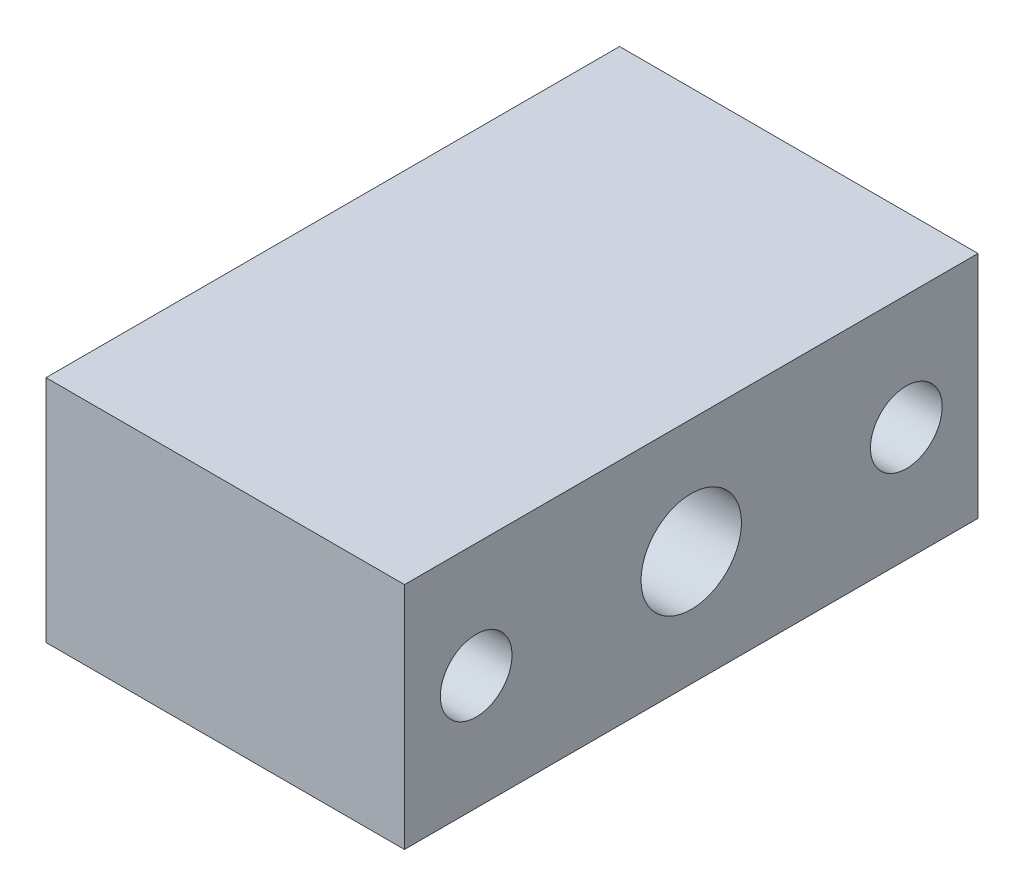
ISO-10303-21;
HEADER;
FILE_DESCRIPTION(('STEP AP214'),'2;1');
FILE_NAME('part.step','',(''),(''),'','','');
FILE_SCHEMA(('AUTOMOTIVE_DESIGN { 1 0 10303 214 1 1 1 1 }'));
ENDSEC;
DATA;
#1=APPLICATION_CONTEXT('core data for automotive mechanical design processes');
#2=APPLICATION_PROTOCOL_DEFINITION('international standard','automotive_design',2000,#1);
#3=PRODUCT_CONTEXT('',#1,'mechanical');
#4=PRODUCT('Part','Part','',(#3));
#5=PRODUCT_RELATED_PRODUCT_CATEGORY('part','',(#4));
#6=PRODUCT_DEFINITION_FORMATION('','',#4);
#7=PRODUCT_DEFINITION_CONTEXT('part definition',#1,'design');
#8=PRODUCT_DEFINITION('design','',#6,#7);
#9=PRODUCT_DEFINITION_SHAPE('','',#8);
#10=(LENGTH_UNIT() NAMED_UNIT(*) SI_UNIT(.MILLI.,.METRE.));
#11=(NAMED_UNIT(*) PLANE_ANGLE_UNIT() SI_UNIT($,.RADIAN.));
#12=(NAMED_UNIT(*) SI_UNIT($,.STERADIAN.) SOLID_ANGLE_UNIT());
#13=UNCERTAINTY_MEASURE_WITH_UNIT(LENGTH_MEASURE(1.E-05),#10,'distance_accuracy_value','');
#14=(GEOMETRIC_REPRESENTATION_CONTEXT(3) GLOBAL_UNCERTAINTY_ASSIGNED_CONTEXT((#13)) GLOBAL_UNIT_ASSIGNED_CONTEXT((#10,
#11,#12)) REPRESENTATION_CONTEXT('',''));
#15=CARTESIAN_POINT('',(0.,0.,0.));
#16=DIRECTION('',(0.,0.,1.));
#17=DIRECTION('',(1.,0.,0.));
#18=AXIS2_PLACEMENT_3D('',#15,#16,#17);
#19=CARTESIAN_POINT('',(50.,-16.,-40.));
#20=DIRECTION('',(0.,0.,1.));
#21=DIRECTION('',(0.,-1.,0.));
#22=AXIS2_PLACEMENT_3D('',#19,#20,#21);
#23=PLANE('',#22);
#24=DIRECTION('',(0.,1.,0.));
#25=VECTOR('',#24,1.);
#26=CARTESIAN_POINT('',(0.,-16.,-40.));
#27=LINE('',#26,#25);
#28=CARTESIAN_POINT('',(0.,-16.,-40.));
#29=VERTEX_POINT('',#28);
#30=CARTESIAN_POINT('',(0.,16.,-40.));
#31=VERTEX_POINT('',#30);
#32=EDGE_CURVE('E106',#29,#31,#27,.T.);
#33=ORIENTED_EDGE('',*,*,#32,.T.);
#34=DIRECTION('',(-1.,0.,0.));
#35=VECTOR('',#34,1.);
#36=CARTESIAN_POINT('',(50.,16.,-40.));
#37=LINE('',#36,#35);
#38=CARTESIAN_POINT('',(50.,16.,-40.));
#39=VERTEX_POINT('',#38);
#40=EDGE_CURVE('E11',#39,#31,#37,.T.);
#41=ORIENTED_EDGE('',*,*,#40,.F.);
#42=DIRECTION('',(0.,1.,0.));
#43=VECTOR('',#42,1.);
#44=CARTESIAN_POINT('',(50.,-16.,-40.));
#45=LINE('',#44,#43);
#46=CARTESIAN_POINT('',(50.,-16.,-40.));
#47=VERTEX_POINT('',#46);
#48=EDGE_CURVE('E94',#47,#39,#45,.T.);
#49=ORIENTED_EDGE('',*,*,#48,.F.);
#50=DIRECTION('',(-1.,0.,0.));
#51=VECTOR('',#50,1.);
#52=CARTESIAN_POINT('',(50.,-16.,-40.));
#53=LINE('',#52,#51);
#54=EDGE_CURVE('E102',#47,#29,#53,.T.);
#55=ORIENTED_EDGE('',*,*,#54,.T.);
#56=EDGE_LOOP('',(#33,#41,#49,#55));
#57=FACE_BOUND('',#56,.T.);
#58=ADVANCED_FACE('F43',(#57),#23,.F.);
#59=CARTESIAN_POINT('',(50.,16.,40.));
#60=DIRECTION('',(0.,-1.,0.));
#61=DIRECTION('',(0.,0.,-1.));
#62=AXIS2_PLACEMENT_3D('',#59,#60,#61);
#63=PLANE('',#62);
#64=DIRECTION('',(0.,0.,1.));
#65=VECTOR('',#64,1.);
#66=CARTESIAN_POINT('',(0.,16.,40.));
#67=LINE('',#66,#65);
#68=CARTESIAN_POINT('',(0.,16.,40.));
#69=VERTEX_POINT('',#68);
#70=EDGE_CURVE('E98',#31,#69,#67,.T.);
#71=ORIENTED_EDGE('',*,*,#70,.T.);
#72=DIRECTION('',(-1.,0.,0.));
#73=VECTOR('',#72,1.);
#74=CARTESIAN_POINT('',(50.,16.,40.));
#75=LINE('',#74,#73);
#76=CARTESIAN_POINT('',(50.,16.,40.));
#77=VERTEX_POINT('',#76);
#78=EDGE_CURVE('E51',#77,#69,#75,.T.);
#79=ORIENTED_EDGE('',*,*,#78,.F.);
#80=DIRECTION('',(0.,0.,1.));
#81=VECTOR('',#80,1.);
#82=CARTESIAN_POINT('',(50.,16.,40.));
#83=LINE('',#82,#81);
#84=EDGE_CURVE('E89',#39,#77,#83,.T.);
#85=ORIENTED_EDGE('',*,*,#84,.F.);
#86=ORIENTED_EDGE('',*,*,#40,.T.);
#87=EDGE_LOOP('',(#71,#79,#85,#86));
#88=FACE_BOUND('',#87,.T.);
#89=ADVANCED_FACE('F97',(#88),#63,.F.);
#90=CARTESIAN_POINT('',(50.,-16.,40.));
#91=DIRECTION('',(0.,0.,-1.));
#92=DIRECTION('',(-1.,0.,0.));
#93=AXIS2_PLACEMENT_3D('',#90,#91,#92);
#94=PLANE('',#93);
#95=DIRECTION('',(0.,-1.,0.));
#96=VECTOR('',#95,1.);
#97=CARTESIAN_POINT('',(0.,-16.,40.));
#98=LINE('',#97,#96);
#99=CARTESIAN_POINT('',(0.,-16.,40.));
#100=VERTEX_POINT('',#99);
#101=EDGE_CURVE('E76',#69,#100,#98,.T.);
#102=ORIENTED_EDGE('',*,*,#101,.T.);
#103=DIRECTION('',(-1.,0.,0.));
#104=VECTOR('',#103,1.);
#105=CARTESIAN_POINT('',(50.,-16.,40.));
#106=LINE('',#105,#104);
#107=CARTESIAN_POINT('',(50.,-16.,40.));
#108=VERTEX_POINT('',#107);
#109=EDGE_CURVE('E99',#108,#100,#106,.T.);
#110=ORIENTED_EDGE('',*,*,#109,.F.);
#111=DIRECTION('',(0.,-1.,0.));
#112=VECTOR('',#111,1.);
#113=CARTESIAN_POINT('',(50.,-16.,40.));
#114=LINE('',#113,#112);
#115=EDGE_CURVE('E92',#77,#108,#114,.T.);
#116=ORIENTED_EDGE('',*,*,#115,.F.);
#117=ORIENTED_EDGE('',*,*,#78,.T.);
#118=EDGE_LOOP('',(#102,#110,#116,#117));
#119=FACE_BOUND('',#118,.T.);
#120=ADVANCED_FACE('F100',(#119),#94,.F.);
#121=CARTESIAN_POINT('',(50.,-16.,40.));
#122=DIRECTION('',(0.,1.,0.));
#123=DIRECTION('',(0.,0.,1.));
#124=AXIS2_PLACEMENT_3D('',#121,#122,#123);
#125=PLANE('',#124);
#126=DIRECTION('',(0.,0.,-1.));
#127=VECTOR('',#126,1.);
#128=CARTESIAN_POINT('',(0.,-16.,40.));
#129=LINE('',#128,#127);
#130=EDGE_CURVE('E82',#100,#29,#129,.T.);
#131=ORIENTED_EDGE('',*,*,#130,.T.);
#132=ORIENTED_EDGE('',*,*,#54,.F.);
#133=DIRECTION('',(0.,0.,-1.));
#134=VECTOR('',#133,1.);
#135=CARTESIAN_POINT('',(50.,-16.,40.));
#136=LINE('',#135,#134);
#137=EDGE_CURVE('E59',#108,#47,#136,.T.);
#138=ORIENTED_EDGE('',*,*,#137,.F.);
#139=ORIENTED_EDGE('',*,*,#109,.T.);
#140=EDGE_LOOP('',(#131,#132,#138,#139));
#141=FACE_BOUND('',#140,.T.);
#142=ADVANCED_FACE('F114',(#141),#125,.F.);
#143=CARTESIAN_POINT('',(50.,0.,0.));
#144=DIRECTION('',(-1.,0.,0.));
#145=DIRECTION('',(0.,0.,1.));
#146=AXIS2_PLACEMENT_3D('',#143,#144,#145);
#147=PLANE('',#146);
#148=CARTESIAN_POINT('',(50.,0.,-30.));
#149=DIRECTION('',(1.,0.,0.));
#150=DIRECTION('',(0.,0.,-1.));
#151=AXIS2_PLACEMENT_3D('',#148,#149,#150);
#152=CIRCLE('',#151,5.);
#153=CARTESIAN_POINT('',(50.,0.,-35.));
#154=VERTEX_POINT('',#153);
#155=EDGE_CURVE('E129',#154,#154,#152,.T.);
#156=ORIENTED_EDGE('',*,*,#155,.F.);
#157=EDGE_LOOP('',(#156));
#158=FACE_BOUND('',#157,.T.);
#159=CARTESIAN_POINT('',(50.,0.,30.));
#160=DIRECTION('',(-1.,0.,0.));
#161=DIRECTION('',(0.,0.,1.));
#162=AXIS2_PLACEMENT_3D('',#159,#160,#161);
#163=CIRCLE('',#162,5.);
#164=CARTESIAN_POINT('',(50.,0.,35.));
#165=VERTEX_POINT('',#164);
#166=EDGE_CURVE('E125',#165,#165,#163,.T.);
#167=ORIENTED_EDGE('',*,*,#166,.T.);
#168=EDGE_LOOP('',(#167));
#169=FACE_BOUND('',#168,.T.);
#170=CARTESIAN_POINT('',(50.,0.,0.));
#171=DIRECTION('',(-1.,0.,0.));
#172=DIRECTION('',(0.,0.,1.));
#173=AXIS2_PLACEMENT_3D('',#170,#171,#172);
#174=CIRCLE('',#173,6.99999999999999);
#175=CARTESIAN_POINT('',(50.,0.,6.99999999999999));
#176=VERTEX_POINT('',#175);
#177=EDGE_CURVE('E109',#176,#176,#174,.T.);
#178=ORIENTED_EDGE('',*,*,#177,.T.);
#179=EDGE_LOOP('',(#178));
#180=FACE_BOUND('',#179,.T.);
#181=ORIENTED_EDGE('',*,*,#48,.T.);
#182=ORIENTED_EDGE('',*,*,#84,.T.);
#183=ORIENTED_EDGE('',*,*,#115,.T.);
#184=ORIENTED_EDGE('',*,*,#137,.T.);
#185=EDGE_LOOP('',(#181,#182,#183,#184));
#186=FACE_BOUND('',#185,.T.);
#187=ADVANCED_FACE('F90',(#158,#169,#180,#186),#147,.F.);
#188=CARTESIAN_POINT('',(0.,0.,0.));
#189=DIRECTION('',(-1.,0.,0.));
#190=DIRECTION('',(0.,0.,1.));
#191=AXIS2_PLACEMENT_3D('',#188,#189,#190);
#192=PLANE('',#191);
#193=CARTESIAN_POINT('',(0.,0.,-30.));
#194=DIRECTION('',(1.,0.,0.));
#195=DIRECTION('',(0.,0.,-1.));
#196=AXIS2_PLACEMENT_3D('',#193,#194,#195);
#197=CIRCLE('',#196,5.);
#198=CARTESIAN_POINT('',(0.,0.,-35.));
#199=VERTEX_POINT('',#198);
#200=EDGE_CURVE('E132',#199,#199,#197,.T.);
#201=ORIENTED_EDGE('',*,*,#200,.T.);
#202=EDGE_LOOP('',(#201));
#203=FACE_BOUND('',#202,.T.);
#204=CARTESIAN_POINT('',(0.,0.,30.));
#205=DIRECTION('',(-1.,0.,0.));
#206=DIRECTION('',(0.,0.,1.));
#207=AXIS2_PLACEMENT_3D('',#204,#205,#206);
#208=CIRCLE('',#207,5.);
#209=CARTESIAN_POINT('',(0.,0.,35.));
#210=VERTEX_POINT('',#209);
#211=EDGE_CURVE('E126',#210,#210,#208,.T.);
#212=ORIENTED_EDGE('',*,*,#211,.F.);
#213=EDGE_LOOP('',(#212));
#214=FACE_BOUND('',#213,.T.);
#215=CARTESIAN_POINT('',(0.,0.,0.));
#216=DIRECTION('',(-1.,0.,0.));
#217=DIRECTION('',(0.,0.,1.));
#218=AXIS2_PLACEMENT_3D('',#215,#216,#217);
#219=CIRCLE('',#218,6.99999999999999);
#220=CARTESIAN_POINT('',(0.,0.,6.99999999999999));
#221=VERTEX_POINT('',#220);
#222=EDGE_CURVE('E122',#221,#221,#219,.T.);
#223=ORIENTED_EDGE('',*,*,#222,.F.);
#224=EDGE_LOOP('',(#223));
#225=FACE_BOUND('',#224,.T.);
#226=ORIENTED_EDGE('',*,*,#32,.F.);
#227=ORIENTED_EDGE('',*,*,#130,.F.);
#228=ORIENTED_EDGE('',*,*,#101,.F.);
#229=ORIENTED_EDGE('',*,*,#70,.F.);
#230=EDGE_LOOP('',(#226,#227,#228,#229));
#231=FACE_BOUND('',#230,.T.);
#232=ADVANCED_FACE('F117',(#203,#214,#225,#231),#192,.T.);
#233=CARTESIAN_POINT('',(0.,0.,0.));
#234=DIRECTION('',(-1.,0.,0.));
#235=DIRECTION('',(0.,0.,1.));
#236=AXIS2_PLACEMENT_3D('',#233,#234,#235);
#237=CYLINDRICAL_SURFACE('',#236,6.99999999999999);
#238=ORIENTED_EDGE('',*,*,#177,.F.);
#239=EDGE_LOOP('',(#238));
#240=FACE_BOUND('',#239,.T.);
#241=ORIENTED_EDGE('',*,*,#222,.T.);
#242=EDGE_LOOP('',(#241));
#243=FACE_BOUND('',#242,.T.);
#244=ADVANCED_FACE('F148',(#240,#243),#237,.F.);
#245=CARTESIAN_POINT('',(50.,0.,30.));
#246=DIRECTION('',(-1.,0.,0.));
#247=DIRECTION('',(0.,0.,1.));
#248=AXIS2_PLACEMENT_3D('',#245,#246,#247);
#249=CYLINDRICAL_SURFACE('',#248,5.);
#250=ORIENTED_EDGE('',*,*,#166,.F.);
#251=EDGE_LOOP('',(#250));
#252=FACE_BOUND('',#251,.T.);
#253=ORIENTED_EDGE('',*,*,#211,.T.);
#254=EDGE_LOOP('',(#253));
#255=FACE_BOUND('',#254,.T.);
#256=ADVANCED_FACE('F151',(#252,#255),#249,.F.);
#257=CARTESIAN_POINT('',(50.,0.,-30.));
#258=DIRECTION('',(-1.,0.,0.));
#259=DIRECTION('',(0.,0.,1.));
#260=AXIS2_PLACEMENT_3D('',#257,#258,#259);
#261=CYLINDRICAL_SURFACE('',#260,5.);
#262=ORIENTED_EDGE('',*,*,#155,.T.);
#263=EDGE_LOOP('',(#262));
#264=FACE_BOUND('',#263,.T.);
#265=ORIENTED_EDGE('',*,*,#200,.F.);
#266=EDGE_LOOP('',(#265));
#267=FACE_BOUND('',#266,.T.);
#268=ADVANCED_FACE('F138',(#264,#267),#261,.F.);
#269=CLOSED_SHELL('',(#58,#89,#120,#142,#187,#232,#244,#256,#268));
#270=MANIFOLD_SOLID_BREP('B2',#269);
#271=ADVANCED_BREP_SHAPE_REPRESENTATION('',(#18,#270),#14);
#272=SHAPE_DEFINITION_REPRESENTATION(#9,#271);
ENDSEC;
END-ISO-10303-21;
